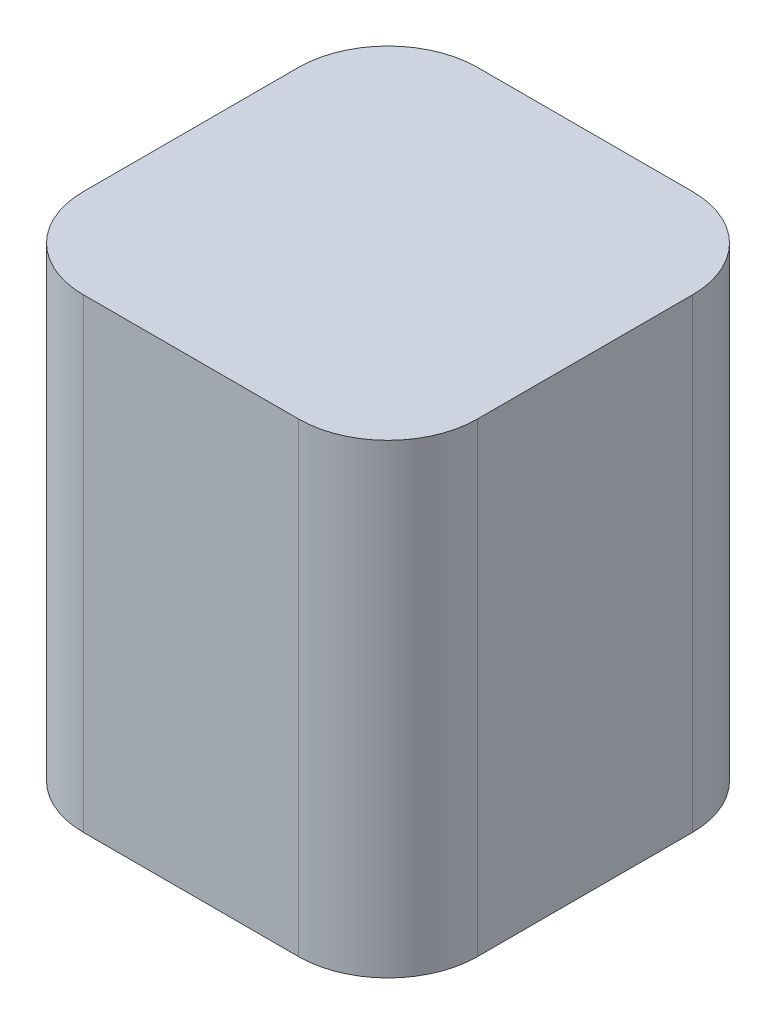
ISO-10303-21;
HEADER;
FILE_DESCRIPTION(('STEP AP214'),'2;1');
FILE_NAME('part.step','',(''),(''),'','','');
FILE_SCHEMA(('AUTOMOTIVE_DESIGN { 1 0 10303 214 1 1 1 1 }'));
ENDSEC;
DATA;
#1=APPLICATION_CONTEXT('core data for automotive mechanical design processes');
#2=APPLICATION_PROTOCOL_DEFINITION('international standard','automotive_design',2000,#1);
#3=PRODUCT_CONTEXT('',#1,'mechanical');
#4=PRODUCT('Part','Part','',(#3));
#5=PRODUCT_RELATED_PRODUCT_CATEGORY('part','',(#4));
#6=PRODUCT_DEFINITION_FORMATION('','',#4);
#7=PRODUCT_DEFINITION_CONTEXT('part definition',#1,'design');
#8=PRODUCT_DEFINITION('design','',#6,#7);
#9=PRODUCT_DEFINITION_SHAPE('','',#8);
#10=(LENGTH_UNIT() NAMED_UNIT(*) SI_UNIT(.MILLI.,.METRE.));
#11=(NAMED_UNIT(*) PLANE_ANGLE_UNIT() SI_UNIT($,.RADIAN.));
#12=(NAMED_UNIT(*) SI_UNIT($,.STERADIAN.) SOLID_ANGLE_UNIT());
#13=UNCERTAINTY_MEASURE_WITH_UNIT(LENGTH_MEASURE(1.E-05),#10,'distance_accuracy_value','');
#14=(GEOMETRIC_REPRESENTATION_CONTEXT(3) GLOBAL_UNCERTAINTY_ASSIGNED_CONTEXT((#13)) GLOBAL_UNIT_ASSIGNED_CONTEXT((#10,
#11,#12)) REPRESENTATION_CONTEXT('',''));
#15=CARTESIAN_POINT('',(0.,0.,0.));
#16=DIRECTION('',(0.,0.,1.));
#17=DIRECTION('',(1.,0.,0.));
#18=AXIS2_PLACEMENT_3D('',#15,#16,#17);
#19=CARTESIAN_POINT('',(27.94,66.04,27.94));
#20=DIRECTION('',(-1.,0.,0.));
#21=DIRECTION('',(0.,0.,1.));
#22=AXIS2_PLACEMENT_3D('',#19,#20,#21);
#23=PLANE('',#22);
#24=DIRECTION('',(0.,0.,-1.));
#25=VECTOR('',#24,1.);
#26=CARTESIAN_POINT('',(27.94,0.,27.94));
#27=LINE('',#26,#25);
#28=CARTESIAN_POINT('',(27.94,0.,15.24));
#29=VERTEX_POINT('',#28);
#30=CARTESIAN_POINT('',(27.94,0.,-15.24));
#31=VERTEX_POINT('',#30);
#32=EDGE_CURVE('E130',#29,#31,#27,.T.);
#33=ORIENTED_EDGE('',*,*,#32,.T.);
#34=DIRECTION('',(0.,-1.,0.));
#35=VECTOR('',#34,1.);
#36=CARTESIAN_POINT('',(27.94,66.04,-15.24));
#37=LINE('',#36,#35);
#38=CARTESIAN_POINT('',(27.94,66.04,-15.24));
#39=VERTEX_POINT('',#38);
#40=EDGE_CURVE('E152',#31,#39,#37,.F.);
#41=ORIENTED_EDGE('',*,*,#40,.T.);
#42=DIRECTION('',(0.,0.,-1.));
#43=VECTOR('',#42,1.);
#44=CARTESIAN_POINT('',(27.94,66.04,27.94));
#45=LINE('',#44,#43);
#46=CARTESIAN_POINT('',(27.94,66.04,15.24));
#47=VERTEX_POINT('',#46);
#48=EDGE_CURVE('E128',#47,#39,#45,.T.);
#49=ORIENTED_EDGE('',*,*,#48,.F.);
#50=DIRECTION('',(0.,-1.,0.));
#51=VECTOR('',#50,1.);
#52=CARTESIAN_POINT('',(27.94,66.04,15.24));
#53=LINE('',#52,#51);
#54=EDGE_CURVE('E149',#47,#29,#53,.T.);
#55=ORIENTED_EDGE('',*,*,#54,.T.);
#56=EDGE_LOOP('',(#33,#41,#49,#55));
#57=FACE_BOUND('',#56,.T.);
#58=ADVANCED_FACE('F33',(#57),#23,.F.);
#59=CARTESIAN_POINT('',(-27.94,66.04,-27.94));
#60=DIRECTION('',(0.,0.,1.));
#61=DIRECTION('',(1.,0.,0.));
#62=AXIS2_PLACEMENT_3D('',#59,#60,#61);
#63=PLANE('',#62);
#64=DIRECTION('',(-1.,0.,0.));
#65=VECTOR('',#64,1.);
#66=CARTESIAN_POINT('',(-27.94,0.,-27.94));
#67=LINE('',#66,#65);
#68=CARTESIAN_POINT('',(15.24,0.,-27.94));
#69=VERTEX_POINT('',#68);
#70=CARTESIAN_POINT('',(-15.24,0.,-27.94));
#71=VERTEX_POINT('',#70);
#72=EDGE_CURVE('E126',#69,#71,#67,.T.);
#73=ORIENTED_EDGE('',*,*,#72,.T.);
#74=DIRECTION('',(0.,-1.,0.));
#75=VECTOR('',#74,1.);
#76=CARTESIAN_POINT('',(-15.24,66.04,-27.94));
#77=LINE('',#76,#75);
#78=CARTESIAN_POINT('',(-15.24,66.04,-27.94));
#79=VERTEX_POINT('',#78);
#80=EDGE_CURVE('E104',#71,#79,#77,.F.);
#81=ORIENTED_EDGE('',*,*,#80,.T.);
#82=DIRECTION('',(-1.,0.,0.));
#83=VECTOR('',#82,1.);
#84=CARTESIAN_POINT('',(-27.94,66.04,-27.94));
#85=LINE('',#84,#83);
#86=CARTESIAN_POINT('',(15.24,66.04,-27.94));
#87=VERTEX_POINT('',#86);
#88=EDGE_CURVE('E166',#87,#79,#85,.T.);
#89=ORIENTED_EDGE('',*,*,#88,.F.);
#90=DIRECTION('',(0.,-1.,0.));
#91=VECTOR('',#90,1.);
#92=CARTESIAN_POINT('',(15.24,66.04,-27.94));
#93=LINE('',#92,#91);
#94=EDGE_CURVE('E109',#87,#69,#93,.T.);
#95=ORIENTED_EDGE('',*,*,#94,.T.);
#96=EDGE_LOOP('',(#73,#81,#89,#95));
#97=FACE_BOUND('',#96,.T.);
#98=ADVANCED_FACE('F171',(#97),#63,.F.);
#99=CARTESIAN_POINT('',(-27.94,66.04,27.94));
#100=DIRECTION('',(1.,0.,0.));
#101=DIRECTION('',(0.,0.,-1.));
#102=AXIS2_PLACEMENT_3D('',#99,#100,#101);
#103=PLANE('',#102);
#104=DIRECTION('',(0.,0.,1.));
#105=VECTOR('',#104,1.);
#106=CARTESIAN_POINT('',(-27.94,66.04,27.94));
#107=LINE('',#106,#105);
#108=CARTESIAN_POINT('',(-27.94,66.04,-15.24));
#109=VERTEX_POINT('',#108);
#110=CARTESIAN_POINT('',(-27.94,66.04,15.24));
#111=VERTEX_POINT('',#110);
#112=EDGE_CURVE('E118',#109,#111,#107,.T.);
#113=ORIENTED_EDGE('',*,*,#112,.F.);
#114=DIRECTION('',(0.,-1.,0.));
#115=VECTOR('',#114,1.);
#116=CARTESIAN_POINT('',(-27.94,66.04,-15.24));
#117=LINE('',#116,#115);
#118=CARTESIAN_POINT('',(-27.94,0.,-15.24));
#119=VERTEX_POINT('',#118);
#120=EDGE_CURVE('E103',#109,#119,#117,.T.);
#121=ORIENTED_EDGE('',*,*,#120,.T.);
#122=DIRECTION('',(0.,0.,1.));
#123=VECTOR('',#122,1.);
#124=CARTESIAN_POINT('',(-27.94,0.,27.94));
#125=LINE('',#124,#123);
#126=CARTESIAN_POINT('',(-27.94,0.,15.24));
#127=VERTEX_POINT('',#126);
#128=EDGE_CURVE('E116',#119,#127,#125,.T.);
#129=ORIENTED_EDGE('',*,*,#128,.T.);
#130=DIRECTION('',(0.,-1.,0.));
#131=VECTOR('',#130,1.);
#132=CARTESIAN_POINT('',(-27.94,66.04,15.24));
#133=LINE('',#132,#131);
#134=EDGE_CURVE('E120',#127,#111,#133,.F.);
#135=ORIENTED_EDGE('',*,*,#134,.T.);
#136=EDGE_LOOP('',(#113,#121,#129,#135));
#137=FACE_BOUND('',#136,.T.);
#138=ADVANCED_FACE('F115',(#137),#103,.F.);
#139=CARTESIAN_POINT('',(-27.94,66.04,27.94));
#140=DIRECTION('',(0.,0.,-1.));
#141=DIRECTION('',(-1.,0.,0.));
#142=AXIS2_PLACEMENT_3D('',#139,#140,#141);
#143=PLANE('',#142);
#144=DIRECTION('',(1.,0.,0.));
#145=VECTOR('',#144,1.);
#146=CARTESIAN_POINT('',(-27.94,66.04,27.94));
#147=LINE('',#146,#145);
#148=CARTESIAN_POINT('',(-15.24,66.04,27.94));
#149=VERTEX_POINT('',#148);
#150=CARTESIAN_POINT('',(15.24,66.04,27.94));
#151=VERTEX_POINT('',#150);
#152=EDGE_CURVE('E134',#149,#151,#147,.T.);
#153=ORIENTED_EDGE('',*,*,#152,.F.);
#154=DIRECTION('',(0.,-1.,0.));
#155=VECTOR('',#154,1.);
#156=CARTESIAN_POINT('',(-15.24,66.04,27.94));
#157=LINE('',#156,#155);
#158=CARTESIAN_POINT('',(-15.24,0.,27.94));
#159=VERTEX_POINT('',#158);
#160=EDGE_CURVE('E11',#149,#159,#157,.T.);
#161=ORIENTED_EDGE('',*,*,#160,.T.);
#162=DIRECTION('',(1.,0.,0.));
#163=VECTOR('',#162,1.);
#164=CARTESIAN_POINT('',(-27.94,0.,27.94));
#165=LINE('',#164,#163);
#166=CARTESIAN_POINT('',(15.24,0.,27.94));
#167=VERTEX_POINT('',#166);
#168=EDGE_CURVE('E125',#159,#167,#165,.T.);
#169=ORIENTED_EDGE('',*,*,#168,.T.);
#170=DIRECTION('',(0.,-1.,0.));
#171=VECTOR('',#170,1.);
#172=CARTESIAN_POINT('',(15.24,66.04,27.94));
#173=LINE('',#172,#171);
#174=EDGE_CURVE('E41',#167,#151,#173,.F.);
#175=ORIENTED_EDGE('',*,*,#174,.T.);
#176=EDGE_LOOP('',(#153,#161,#169,#175));
#177=FACE_BOUND('',#176,.T.);
#178=ADVANCED_FACE('F178',(#177),#143,.F.);
#179=CARTESIAN_POINT('',(0.,66.04,0.));
#180=DIRECTION('',(0.,-1.,0.));
#181=DIRECTION('',(0.,0.,-1.));
#182=AXIS2_PLACEMENT_3D('',#179,#180,#181);
#183=PLANE('',#182);
#184=ORIENTED_EDGE('',*,*,#88,.T.);
#185=CARTESIAN_POINT('',(-15.24,66.04,-15.24));
#186=DIRECTION('',(0.,-1.,0.));
#187=DIRECTION('',(0.,0.,-1.));
#188=AXIS2_PLACEMENT_3D('',#185,#186,#187);
#189=CIRCLE('',#188,12.7);
#190=EDGE_CURVE('E147',#79,#109,#189,.F.);
#191=ORIENTED_EDGE('',*,*,#190,.T.);
#192=ORIENTED_EDGE('',*,*,#112,.T.);
#193=CARTESIAN_POINT('',(-15.24,66.04,15.24));
#194=DIRECTION('',(0.,-1.,0.));
#195=DIRECTION('',(0.,0.,-1.));
#196=AXIS2_PLACEMENT_3D('',#193,#194,#195);
#197=CIRCLE('',#196,12.7);
#198=EDGE_CURVE('E54',#111,#149,#197,.F.);
#199=ORIENTED_EDGE('',*,*,#198,.T.);
#200=ORIENTED_EDGE('',*,*,#152,.T.);
#201=CARTESIAN_POINT('',(15.24,66.04,15.24));
#202=DIRECTION('',(0.,-1.,0.));
#203=DIRECTION('',(0.,0.,-1.));
#204=AXIS2_PLACEMENT_3D('',#201,#202,#203);
#205=CIRCLE('',#204,12.7);
#206=EDGE_CURVE('E142',#151,#47,#205,.F.);
#207=ORIENTED_EDGE('',*,*,#206,.T.);
#208=ORIENTED_EDGE('',*,*,#48,.T.);
#209=CARTESIAN_POINT('',(15.24,66.04,-15.24));
#210=DIRECTION('',(0.,-1.,0.));
#211=DIRECTION('',(0.,0.,-1.));
#212=AXIS2_PLACEMENT_3D('',#209,#210,#211);
#213=CIRCLE('',#212,12.7);
#214=EDGE_CURVE('E145',#39,#87,#213,.F.);
#215=ORIENTED_EDGE('',*,*,#214,.T.);
#216=EDGE_LOOP('',(#184,#191,#192,#199,#200,#207,#208,#215));
#217=FACE_BOUND('',#216,.T.);
#218=ADVANCED_FACE('F163',(#217),#183,.F.);
#219=CARTESIAN_POINT('',(0.,0.,0.));
#220=DIRECTION('',(0.,-1.,0.));
#221=DIRECTION('',(0.,0.,-1.));
#222=AXIS2_PLACEMENT_3D('',#219,#220,#221);
#223=PLANE('',#222);
#224=ORIENTED_EDGE('',*,*,#128,.F.);
#225=CARTESIAN_POINT('',(-15.24,0.,-15.24));
#226=DIRECTION('',(0.,-1.,0.));
#227=DIRECTION('',(0.,0.,-1.));
#228=AXIS2_PLACEMENT_3D('',#225,#226,#227);
#229=CIRCLE('',#228,12.7);
#230=EDGE_CURVE('E99',#119,#71,#229,.T.);
#231=ORIENTED_EDGE('',*,*,#230,.T.);
#232=ORIENTED_EDGE('',*,*,#72,.F.);
#233=CARTESIAN_POINT('',(15.24,0.,-15.24));
#234=DIRECTION('',(0.,-1.,0.));
#235=DIRECTION('',(0.,0.,-1.));
#236=AXIS2_PLACEMENT_3D('',#233,#234,#235);
#237=CIRCLE('',#236,12.7);
#238=EDGE_CURVE('E110',#69,#31,#237,.T.);
#239=ORIENTED_EDGE('',*,*,#238,.T.);
#240=ORIENTED_EDGE('',*,*,#32,.F.);
#241=CARTESIAN_POINT('',(15.24,0.,15.24));
#242=DIRECTION('',(0.,-1.,0.));
#243=DIRECTION('',(0.,0.,-1.));
#244=AXIS2_PLACEMENT_3D('',#241,#242,#243);
#245=CIRCLE('',#244,12.7);
#246=EDGE_CURVE('E119',#29,#167,#245,.T.);
#247=ORIENTED_EDGE('',*,*,#246,.T.);
#248=ORIENTED_EDGE('',*,*,#168,.F.);
#249=CARTESIAN_POINT('',(-15.24,0.,15.24));
#250=DIRECTION('',(0.,-1.,0.));
#251=DIRECTION('',(0.,0.,-1.));
#252=AXIS2_PLACEMENT_3D('',#249,#250,#251);
#253=CIRCLE('',#252,12.7);
#254=EDGE_CURVE('E124',#159,#127,#253,.T.);
#255=ORIENTED_EDGE('',*,*,#254,.T.);
#256=EDGE_LOOP('',(#224,#231,#232,#239,#240,#247,#248,#255));
#257=FACE_BOUND('',#256,.T.);
#258=ADVANCED_FACE('F122',(#257),#223,.T.);
#259=CARTESIAN_POINT('',(-15.24,66.04,-15.24));
#260=DIRECTION('',(0.,-1.,0.));
#261=DIRECTION('',(0.,0.,-1.));
#262=AXIS2_PLACEMENT_3D('',#259,#260,#261);
#263=CYLINDRICAL_SURFACE('',#262,12.7);
#264=ORIENTED_EDGE('',*,*,#190,.F.);
#265=ORIENTED_EDGE('',*,*,#80,.F.);
#266=ORIENTED_EDGE('',*,*,#230,.F.);
#267=ORIENTED_EDGE('',*,*,#120,.F.);
#268=EDGE_LOOP('',(#264,#265,#266,#267));
#269=FACE_BOUND('',#268,.T.);
#270=ADVANCED_FACE('F102',(#269),#263,.T.);
#271=CARTESIAN_POINT('',(15.24,66.04,-15.24));
#272=DIRECTION('',(0.,-1.,0.));
#273=DIRECTION('',(0.,0.,-1.));
#274=AXIS2_PLACEMENT_3D('',#271,#272,#273);
#275=CYLINDRICAL_SURFACE('',#274,12.7);
#276=ORIENTED_EDGE('',*,*,#214,.F.);
#277=ORIENTED_EDGE('',*,*,#40,.F.);
#278=ORIENTED_EDGE('',*,*,#238,.F.);
#279=ORIENTED_EDGE('',*,*,#94,.F.);
#280=EDGE_LOOP('',(#276,#277,#278,#279));
#281=FACE_BOUND('',#280,.T.);
#282=ADVANCED_FACE('F169',(#281),#275,.T.);
#283=CARTESIAN_POINT('',(-15.24,66.04,15.24));
#284=DIRECTION('',(0.,-1.,0.));
#285=DIRECTION('',(0.,0.,-1.));
#286=AXIS2_PLACEMENT_3D('',#283,#284,#285);
#287=CYLINDRICAL_SURFACE('',#286,12.7);
#288=ORIENTED_EDGE('',*,*,#198,.F.);
#289=ORIENTED_EDGE('',*,*,#134,.F.);
#290=ORIENTED_EDGE('',*,*,#254,.F.);
#291=ORIENTED_EDGE('',*,*,#160,.F.);
#292=EDGE_LOOP('',(#288,#289,#290,#291));
#293=FACE_BOUND('',#292,.T.);
#294=ADVANCED_FACE('F177',(#293),#287,.T.);
#295=CARTESIAN_POINT('',(15.24,66.04,15.24));
#296=DIRECTION('',(0.,-1.,0.));
#297=DIRECTION('',(0.,0.,-1.));
#298=AXIS2_PLACEMENT_3D('',#295,#296,#297);
#299=CYLINDRICAL_SURFACE('',#298,12.7);
#300=ORIENTED_EDGE('',*,*,#206,.F.);
#301=ORIENTED_EDGE('',*,*,#174,.F.);
#302=ORIENTED_EDGE('',*,*,#246,.F.);
#303=ORIENTED_EDGE('',*,*,#54,.F.);
#304=EDGE_LOOP('',(#300,#301,#302,#303));
#305=FACE_BOUND('',#304,.T.);
#306=ADVANCED_FACE('F35',(#305),#299,.T.);
#307=CLOSED_SHELL('',(#58,#98,#138,#178,#218,#258,#270,#282,#294,#306));
#308=MANIFOLD_SOLID_BREP('B2',#307);
#309=ADVANCED_BREP_SHAPE_REPRESENTATION('',(#18,#308),#14);
#310=SHAPE_DEFINITION_REPRESENTATION(#9,#309);
ENDSEC;
END-ISO-10303-21;
